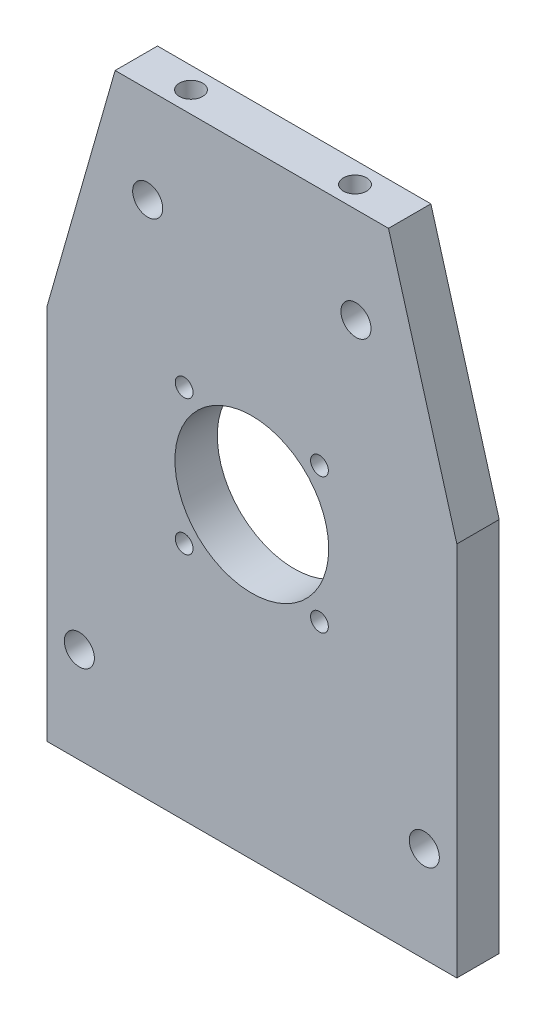
ISO-10303-21;
HEADER;
FILE_DESCRIPTION(('STEP AP214'),'2;1');
FILE_NAME('part.step','',(''),(''),'','','');
FILE_SCHEMA(('AUTOMOTIVE_DESIGN { 1 0 10303 214 1 1 1 1 }'));
ENDSEC;
DATA;
#1=APPLICATION_CONTEXT('core data for automotive mechanical design processes');
#2=APPLICATION_PROTOCOL_DEFINITION('international standard','automotive_design',2000,#1);
#3=PRODUCT_CONTEXT('',#1,'mechanical');
#4=PRODUCT('Part','Part','',(#3));
#5=PRODUCT_RELATED_PRODUCT_CATEGORY('part','',(#4));
#6=PRODUCT_DEFINITION_FORMATION('','',#4);
#7=PRODUCT_DEFINITION_CONTEXT('part definition',#1,'design');
#8=PRODUCT_DEFINITION('design','',#6,#7);
#9=PRODUCT_DEFINITION_SHAPE('','',#8);
#10=(LENGTH_UNIT() NAMED_UNIT(*) SI_UNIT(.MILLI.,.METRE.));
#11=(NAMED_UNIT(*) PLANE_ANGLE_UNIT() SI_UNIT($,.RADIAN.));
#12=(NAMED_UNIT(*) SI_UNIT($,.STERADIAN.) SOLID_ANGLE_UNIT());
#13=UNCERTAINTY_MEASURE_WITH_UNIT(LENGTH_MEASURE(1.E-05),#10,'distance_accuracy_value','');
#14=(GEOMETRIC_REPRESENTATION_CONTEXT(3) GLOBAL_UNCERTAINTY_ASSIGNED_CONTEXT((#13)) GLOBAL_UNIT_ASSIGNED_CONTEXT((#10,
#11,#12)) REPRESENTATION_CONTEXT('',''));
#15=CARTESIAN_POINT('',(0.,0.,0.));
#16=DIRECTION('',(0.,0.,1.));
#17=DIRECTION('',(1.,0.,0.));
#18=AXIS2_PLACEMENT_3D('',#15,#16,#17);
#19=CARTESIAN_POINT('',(-20.,45.,3.1));
#20=DIRECTION('',(0.961523947640823,-0.274721127897378,0.));
#21=DIRECTION('',(0.274721127897378,0.961523947640823,0.));
#22=AXIS2_PLACEMENT_3D('',#19,#20,#21);
#23=PLANE('',#22);
#24=DIRECTION('',(-0.274721127897378,-0.961523947640823,0.));
#25=VECTOR('',#24,1.);
#26=CARTESIAN_POINT('',(-20.,45.,-3.1));
#27=LINE('',#26,#25);
#28=CARTESIAN_POINT('',(-20.,45.,-3.1));
#29=VERTEX_POINT('',#28);
#30=CARTESIAN_POINT('',(-30.,9.99999999999999,-3.1));
#31=VERTEX_POINT('',#30);
#32=EDGE_CURVE('E127',#29,#31,#27,.T.);
#33=ORIENTED_EDGE('',*,*,#32,.T.);
#34=DIRECTION('',(0.,0.,-1.));
#35=VECTOR('',#34,1.);
#36=CARTESIAN_POINT('',(-30.,9.99999999999999,3.1));
#37=LINE('',#36,#35);
#38=CARTESIAN_POINT('',(-30.,9.99999999999999,3.1));
#39=VERTEX_POINT('',#38);
#40=EDGE_CURVE('E12',#39,#31,#37,.T.);
#41=ORIENTED_EDGE('',*,*,#40,.F.);
#42=DIRECTION('',(-0.274721127897378,-0.961523947640823,0.));
#43=VECTOR('',#42,1.);
#44=CARTESIAN_POINT('',(-20.,45.,3.1));
#45=LINE('',#44,#43);
#46=CARTESIAN_POINT('',(-20.,45.,3.1));
#47=VERTEX_POINT('',#46);
#48=EDGE_CURVE('E144',#47,#39,#45,.T.);
#49=ORIENTED_EDGE('',*,*,#48,.F.);
#50=DIRECTION('',(0.,0.,-1.));
#51=VECTOR('',#50,1.);
#52=CARTESIAN_POINT('',(-20.,45.,3.1));
#53=LINE('',#52,#51);
#54=EDGE_CURVE('E123',#47,#29,#53,.T.);
#55=ORIENTED_EDGE('',*,*,#54,.T.);
#56=EDGE_LOOP('',(#33,#41,#49,#55));
#57=FACE_BOUND('',#56,.T.);
#58=ADVANCED_FACE('F41',(#57),#23,.F.);
#59=CARTESIAN_POINT('',(-30.,9.99999999999999,3.1));
#60=DIRECTION('',(1.,0.,0.));
#61=DIRECTION('',(0.,1.,0.));
#62=AXIS2_PLACEMENT_3D('',#59,#60,#61);
#63=PLANE('',#62);
#64=DIRECTION('',(0.,-1.,0.));
#65=VECTOR('',#64,1.);
#66=CARTESIAN_POINT('',(-30.,9.99999999999999,-3.1));
#67=LINE('',#66,#65);
#68=CARTESIAN_POINT('',(-30.,-45.,-3.1));
#69=VERTEX_POINT('',#68);
#70=EDGE_CURVE('E131',#31,#69,#67,.T.);
#71=ORIENTED_EDGE('',*,*,#70,.T.);
#72=DIRECTION('',(0.,0.,-1.));
#73=VECTOR('',#72,1.);
#74=CARTESIAN_POINT('',(-30.,-45.,3.1));
#75=LINE('',#74,#73);
#76=CARTESIAN_POINT('',(-30.,-45.,3.1));
#77=VERTEX_POINT('',#76);
#78=EDGE_CURVE('E51',#77,#69,#75,.T.);
#79=ORIENTED_EDGE('',*,*,#78,.F.);
#80=DIRECTION('',(0.,-1.,0.));
#81=VECTOR('',#80,1.);
#82=CARTESIAN_POINT('',(-30.,9.99999999999999,3.1));
#83=LINE('',#82,#81);
#84=EDGE_CURVE('E96',#39,#77,#83,.T.);
#85=ORIENTED_EDGE('',*,*,#84,.F.);
#86=ORIENTED_EDGE('',*,*,#40,.T.);
#87=EDGE_LOOP('',(#71,#79,#85,#86));
#88=FACE_BOUND('',#87,.T.);
#89=ADVANCED_FACE('F163',(#88),#63,.F.);
#90=CARTESIAN_POINT('',(-30.,-45.,3.1));
#91=DIRECTION('',(0.,1.,0.));
#92=DIRECTION('',(-1.,0.,0.));
#93=AXIS2_PLACEMENT_3D('',#90,#91,#92);
#94=PLANE('',#93);
#95=CARTESIAN_POINT('',(20.,-45.,0.));
#96=DIRECTION('',(0.,-1.,0.));
#97=DIRECTION('',(1.,0.,0.));
#98=AXIS2_PLACEMENT_3D('',#95,#96,#97);
#99=CIRCLE('',#98,1.7);
#100=CARTESIAN_POINT('',(21.7,-45.,0.));
#101=VERTEX_POINT('',#100);
#102=EDGE_CURVE('E230',#101,#101,#99,.T.);
#103=ORIENTED_EDGE('',*,*,#102,.F.);
#104=EDGE_LOOP('',(#103));
#105=FACE_BOUND('',#104,.T.);
#106=CARTESIAN_POINT('',(-20.,-45.,0.));
#107=DIRECTION('',(0.,-1.,0.));
#108=DIRECTION('',(-1.,0.,0.));
#109=AXIS2_PLACEMENT_3D('',#106,#107,#108);
#110=CIRCLE('',#109,1.7);
#111=CARTESIAN_POINT('',(-21.7,-45.,0.));
#112=VERTEX_POINT('',#111);
#113=EDGE_CURVE('E236',#112,#112,#110,.T.);
#114=ORIENTED_EDGE('',*,*,#113,.F.);
#115=EDGE_LOOP('',(#114));
#116=FACE_BOUND('',#115,.T.);
#117=CARTESIAN_POINT('',(0.,-45.,0.));
#118=DIRECTION('',(0.,-1.,0.));
#119=DIRECTION('',(1.,0.,0.));
#120=AXIS2_PLACEMENT_3D('',#117,#118,#119);
#121=CIRCLE('',#120,1.7);
#122=CARTESIAN_POINT('',(1.7,-45.,0.));
#123=VERTEX_POINT('',#122);
#124=EDGE_CURVE('E210',#123,#123,#121,.T.);
#125=ORIENTED_EDGE('',*,*,#124,.F.);
#126=EDGE_LOOP('',(#125));
#127=FACE_BOUND('',#126,.T.);
#128=DIRECTION('',(1.,0.,0.));
#129=VECTOR('',#128,1.);
#130=CARTESIAN_POINT('',(-30.,-45.,-3.1));
#131=LINE('',#130,#129);
#132=CARTESIAN_POINT('',(30.,-45.,-3.1));
#133=VERTEX_POINT('',#132);
#134=EDGE_CURVE('E154',#69,#133,#131,.T.);
#135=ORIENTED_EDGE('',*,*,#134,.T.);
#136=DIRECTION('',(0.,0.,-1.));
#137=VECTOR('',#136,1.);
#138=CARTESIAN_POINT('',(30.,-45.,3.1));
#139=LINE('',#138,#137);
#140=CARTESIAN_POINT('',(30.,-45.,3.1));
#141=VERTEX_POINT('',#140);
#142=EDGE_CURVE('E118',#141,#133,#139,.T.);
#143=ORIENTED_EDGE('',*,*,#142,.F.);
#144=DIRECTION('',(1.,0.,0.));
#145=VECTOR('',#144,1.);
#146=CARTESIAN_POINT('',(-30.,-45.,3.1));
#147=LINE('',#146,#145);
#148=EDGE_CURVE('E109',#77,#141,#147,.T.);
#149=ORIENTED_EDGE('',*,*,#148,.F.);
#150=ORIENTED_EDGE('',*,*,#78,.T.);
#151=EDGE_LOOP('',(#135,#143,#149,#150));
#152=FACE_BOUND('',#151,.T.);
#153=ADVANCED_FACE('F153',(#105,#116,#127,#152),#94,.F.);
#154=CARTESIAN_POINT('',(30.,10.,3.1));
#155=DIRECTION('',(-1.,0.,0.));
#156=DIRECTION('',(0.,-1.,0.));
#157=AXIS2_PLACEMENT_3D('',#154,#155,#156);
#158=PLANE('',#157);
#159=DIRECTION('',(0.,1.,0.));
#160=VECTOR('',#159,1.);
#161=CARTESIAN_POINT('',(30.,10.,-3.1));
#162=LINE('',#161,#160);
#163=CARTESIAN_POINT('',(30.,10.,-3.1));
#164=VERTEX_POINT('',#163);
#165=EDGE_CURVE('E117',#133,#164,#162,.T.);
#166=ORIENTED_EDGE('',*,*,#165,.T.);
#167=DIRECTION('',(0.,0.,-1.));
#168=VECTOR('',#167,1.);
#169=CARTESIAN_POINT('',(30.,10.,3.1));
#170=LINE('',#169,#168);
#171=CARTESIAN_POINT('',(30.,10.,3.1));
#172=VERTEX_POINT('',#171);
#173=EDGE_CURVE('E114',#172,#164,#170,.T.);
#174=ORIENTED_EDGE('',*,*,#173,.F.);
#175=DIRECTION('',(0.,1.,0.));
#176=VECTOR('',#175,1.);
#177=CARTESIAN_POINT('',(30.,10.,3.1));
#178=LINE('',#177,#176);
#179=EDGE_CURVE('E103',#141,#172,#178,.T.);
#180=ORIENTED_EDGE('',*,*,#179,.F.);
#181=ORIENTED_EDGE('',*,*,#142,.T.);
#182=EDGE_LOOP('',(#166,#174,#180,#181));
#183=FACE_BOUND('',#182,.T.);
#184=ADVANCED_FACE('F115',(#183),#158,.F.);
#185=CARTESIAN_POINT('',(20.,45.,3.1));
#186=DIRECTION('',(-0.961523947640823,-0.274721127897379,0.));
#187=DIRECTION('',(0.274721127897379,-0.961523947640823,0.));
#188=AXIS2_PLACEMENT_3D('',#185,#186,#187);
#189=PLANE('',#188);
#190=DIRECTION('',(-0.274721127897379,0.961523947640823,0.));
#191=VECTOR('',#190,1.);
#192=CARTESIAN_POINT('',(20.,45.,-3.1));
#193=LINE('',#192,#191);
#194=CARTESIAN_POINT('',(20.,45.,-3.1));
#195=VERTEX_POINT('',#194);
#196=EDGE_CURVE('E82',#164,#195,#193,.T.);
#197=ORIENTED_EDGE('',*,*,#196,.T.);
#198=DIRECTION('',(0.,0.,-1.));
#199=VECTOR('',#198,1.);
#200=CARTESIAN_POINT('',(20.,45.,3.1));
#201=LINE('',#200,#199);
#202=CARTESIAN_POINT('',(20.,45.,3.1));
#203=VERTEX_POINT('',#202);
#204=EDGE_CURVE('E119',#203,#195,#201,.T.);
#205=ORIENTED_EDGE('',*,*,#204,.F.);
#206=DIRECTION('',(-0.274721127897379,0.961523947640823,0.));
#207=VECTOR('',#206,1.);
#208=CARTESIAN_POINT('',(20.,45.,3.1));
#209=LINE('',#208,#207);
#210=EDGE_CURVE('E107',#172,#203,#209,.T.);
#211=ORIENTED_EDGE('',*,*,#210,.F.);
#212=ORIENTED_EDGE('',*,*,#173,.T.);
#213=EDGE_LOOP('',(#197,#205,#211,#212));
#214=FACE_BOUND('',#213,.T.);
#215=ADVANCED_FACE('F121',(#214),#189,.F.);
#216=CARTESIAN_POINT('',(-20.,45.,3.1));
#217=DIRECTION('',(0.,-1.,0.));
#218=DIRECTION('',(1.,0.,0.));
#219=AXIS2_PLACEMENT_3D('',#216,#217,#218);
#220=PLANE('',#219);
#221=CARTESIAN_POINT('',(-12.,45.,0.));
#222=DIRECTION('',(0.,1.,0.));
#223=DIRECTION('',(-1.,0.,0.));
#224=AXIS2_PLACEMENT_3D('',#221,#222,#223);
#225=CIRCLE('',#224,1.7);
#226=CARTESIAN_POINT('',(-13.7,45.,0.));
#227=VERTEX_POINT('',#226);
#228=EDGE_CURVE('E244',#227,#227,#225,.T.);
#229=ORIENTED_EDGE('',*,*,#228,.F.);
#230=EDGE_LOOP('',(#229));
#231=FACE_BOUND('',#230,.T.);
#232=CARTESIAN_POINT('',(12.,45.,0.));
#233=DIRECTION('',(0.,1.,0.));
#234=DIRECTION('',(1.,0.,0.));
#235=AXIS2_PLACEMENT_3D('',#232,#233,#234);
#236=CIRCLE('',#235,1.7);
#237=CARTESIAN_POINT('',(13.7,45.,0.));
#238=VERTEX_POINT('',#237);
#239=EDGE_CURVE('E229',#238,#238,#236,.T.);
#240=ORIENTED_EDGE('',*,*,#239,.F.);
#241=EDGE_LOOP('',(#240));
#242=FACE_BOUND('',#241,.T.);
#243=DIRECTION('',(-1.,0.,0.));
#244=VECTOR('',#243,1.);
#245=CARTESIAN_POINT('',(-20.,45.,-3.1));
#246=LINE('',#245,#244);
#247=EDGE_CURVE('E88',#195,#29,#246,.T.);
#248=ORIENTED_EDGE('',*,*,#247,.T.);
#249=ORIENTED_EDGE('',*,*,#54,.F.);
#250=DIRECTION('',(-1.,0.,0.));
#251=VECTOR('',#250,1.);
#252=CARTESIAN_POINT('',(-20.,45.,3.1));
#253=LINE('',#252,#251);
#254=EDGE_CURVE('E59',#203,#47,#253,.T.);
#255=ORIENTED_EDGE('',*,*,#254,.F.);
#256=ORIENTED_EDGE('',*,*,#204,.T.);
#257=EDGE_LOOP('',(#248,#249,#255,#256));
#258=FACE_BOUND('',#257,.T.);
#259=ADVANCED_FACE('F269',(#231,#242,#258),#220,.F.);
#260=CARTESIAN_POINT('',(0.,0.,3.1));
#261=DIRECTION('',(0.,0.,1.));
#262=DIRECTION('',(1.,0.,0.));
#263=AXIS2_PLACEMENT_3D('',#260,#261,#262);
#264=PLANE('',#263);
#265=CARTESIAN_POINT('',(-25.2375,-31.,3.1));
#266=DIRECTION('',(0.,0.,1.));
#267=DIRECTION('',(1.,0.,0.));
#268=AXIS2_PLACEMENT_3D('',#265,#266,#267);
#269=CIRCLE('',#268,2.2);
#270=CARTESIAN_POINT('',(-23.0375,-31.,3.1));
#271=VERTEX_POINT('',#270);
#272=EDGE_CURVE('E195',#271,#271,#269,.T.);
#273=ORIENTED_EDGE('',*,*,#272,.F.);
#274=EDGE_LOOP('',(#273));
#275=FACE_BOUND('',#274,.T.);
#276=CARTESIAN_POINT('',(15.2375,31.,3.1));
#277=DIRECTION('',(0.,0.,1.));
#278=DIRECTION('',(-1.,0.,0.));
#279=AXIS2_PLACEMENT_3D('',#276,#277,#278);
#280=CIRCLE('',#279,2.2);
#281=CARTESIAN_POINT('',(13.0375,31.,3.1));
#282=VERTEX_POINT('',#281);
#283=EDGE_CURVE('E206',#282,#282,#280,.T.);
#284=ORIENTED_EDGE('',*,*,#283,.F.);
#285=EDGE_LOOP('',(#284));
#286=FACE_BOUND('',#285,.T.);
#287=CARTESIAN_POINT('',(-15.2375,31.,3.1));
#288=DIRECTION('',(0.,0.,1.));
#289=DIRECTION('',(1.,0.,0.));
#290=AXIS2_PLACEMENT_3D('',#287,#288,#289);
#291=CIRCLE('',#290,2.2);
#292=CARTESIAN_POINT('',(-13.0375,31.,3.1));
#293=VERTEX_POINT('',#292);
#294=EDGE_CURVE('E201',#293,#293,#291,.T.);
#295=ORIENTED_EDGE('',*,*,#294,.F.);
#296=EDGE_LOOP('',(#295));
#297=FACE_BOUND('',#296,.T.);
#298=CARTESIAN_POINT('',(25.2375,-31.,3.1));
#299=DIRECTION('',(0.,0.,1.));
#300=DIRECTION('',(-1.,0.,0.));
#301=AXIS2_PLACEMENT_3D('',#298,#299,#300);
#302=CIRCLE('',#301,2.2);
#303=CARTESIAN_POINT('',(23.0375,-31.,3.1));
#304=VERTEX_POINT('',#303);
#305=EDGE_CURVE('E196',#304,#304,#302,.T.);
#306=ORIENTED_EDGE('',*,*,#305,.F.);
#307=EDGE_LOOP('',(#306));
#308=FACE_BOUND('',#307,.T.);
#309=CARTESIAN_POINT('',(-9.89949493661113,-9.89949493661165,3.1));
#310=DIRECTION('',(0.,0.,1.));
#311=DIRECTION('',(1.,0.,0.));
#312=AXIS2_PLACEMENT_3D('',#309,#310,#311);
#313=CIRCLE('',#312,1.3);
#314=CARTESIAN_POINT('',(-8.59949493661112,-9.89949493661165,3.1));
#315=VERTEX_POINT('',#314);
#316=EDGE_CURVE('E190',#315,#315,#313,.T.);
#317=ORIENTED_EDGE('',*,*,#316,.F.);
#318=EDGE_LOOP('',(#317));
#319=FACE_BOUND('',#318,.T.);
#320=CARTESIAN_POINT('',(9.89949493661221,-9.89949493661113,3.1));
#321=DIRECTION('',(0.,0.,1.));
#322=DIRECTION('',(1.,0.,0.));
#323=AXIS2_PLACEMENT_3D('',#320,#321,#322);
#324=CIRCLE('',#323,1.3);
#325=CARTESIAN_POINT('',(11.1994949366122,-9.89949493661113,3.1));
#326=VERTEX_POINT('',#325);
#327=EDGE_CURVE('E185',#326,#326,#324,.T.);
#328=ORIENTED_EDGE('',*,*,#327,.F.);
#329=EDGE_LOOP('',(#328));
#330=FACE_BOUND('',#329,.T.);
#331=CARTESIAN_POINT('',(9.89949493661168,9.8994949366122,3.1));
#332=DIRECTION('',(0.,0.,1.));
#333=DIRECTION('',(1.,0.,0.));
#334=AXIS2_PLACEMENT_3D('',#331,#332,#333);
#335=CIRCLE('',#334,1.3);
#336=CARTESIAN_POINT('',(11.1994949366117,9.8994949366122,3.1));
#337=VERTEX_POINT('',#336);
#338=EDGE_CURVE('E180',#337,#337,#335,.T.);
#339=ORIENTED_EDGE('',*,*,#338,.F.);
#340=EDGE_LOOP('',(#339));
#341=FACE_BOUND('',#340,.T.);
#342=CARTESIAN_POINT('',(-9.89949493661172,9.89949493661161,3.1));
#343=DIRECTION('',(0.,0.,1.));
#344=DIRECTION('',(1.,0.,0.));
#345=AXIS2_PLACEMENT_3D('',#342,#343,#344);
#346=CIRCLE('',#345,1.3);
#347=CARTESIAN_POINT('',(-8.59949493661172,9.89949493661161,3.1));
#348=VERTEX_POINT('',#347);
#349=EDGE_CURVE('E175',#348,#348,#346,.T.);
#350=ORIENTED_EDGE('',*,*,#349,.F.);
#351=EDGE_LOOP('',(#350));
#352=FACE_BOUND('',#351,.T.);
#353=CARTESIAN_POINT('',(0.,0.,3.1));
#354=DIRECTION('',(0.,0.,1.));
#355=DIRECTION('',(1.,0.,0.));
#356=AXIS2_PLACEMENT_3D('',#353,#354,#355);
#357=CIRCLE('',#356,11.25);
#358=CARTESIAN_POINT('',(11.25,0.,3.1));
#359=VERTEX_POINT('',#358);
#360=EDGE_CURVE('E171',#359,#359,#357,.T.);
#361=ORIENTED_EDGE('',*,*,#360,.F.);
#362=EDGE_LOOP('',(#361));
#363=FACE_BOUND('',#362,.T.);
#364=ORIENTED_EDGE('',*,*,#48,.T.);
#365=ORIENTED_EDGE('',*,*,#84,.T.);
#366=ORIENTED_EDGE('',*,*,#148,.T.);
#367=ORIENTED_EDGE('',*,*,#179,.T.);
#368=ORIENTED_EDGE('',*,*,#210,.T.);
#369=ORIENTED_EDGE('',*,*,#254,.T.);
#370=EDGE_LOOP('',(#364,#365,#366,#367,#368,#369));
#371=FACE_BOUND('',#370,.T.);
#372=ADVANCED_FACE('F105',(#275,#286,#297,#308,#319,#330,#341,#352,#363,#371),#264,.T.);
#373=CARTESIAN_POINT('',(0.,0.,-3.1));
#374=DIRECTION('',(0.,0.,1.));
#375=DIRECTION('',(1.,0.,0.));
#376=AXIS2_PLACEMENT_3D('',#373,#374,#375);
#377=PLANE('',#376);
#378=CARTESIAN_POINT('',(-25.2375,-31.,-3.1));
#379=DIRECTION('',(0.,0.,1.));
#380=DIRECTION('',(1.,0.,0.));
#381=AXIS2_PLACEMENT_3D('',#378,#379,#380);
#382=CIRCLE('',#381,2.2);
#383=CARTESIAN_POINT('',(-23.0375,-31.,-3.1));
#384=VERTEX_POINT('',#383);
#385=EDGE_CURVE('E208',#384,#384,#382,.F.);
#386=ORIENTED_EDGE('',*,*,#385,.F.);
#387=EDGE_LOOP('',(#386));
#388=FACE_BOUND('',#387,.T.);
#389=CARTESIAN_POINT('',(15.2375,31.,-3.1));
#390=DIRECTION('',(0.,0.,1.));
#391=DIRECTION('',(1.,0.,0.));
#392=AXIS2_PLACEMENT_3D('',#389,#390,#391);
#393=CIRCLE('',#392,2.2);
#394=CARTESIAN_POINT('',(17.4375,31.,-3.1));
#395=VERTEX_POINT('',#394);
#396=EDGE_CURVE('E203',#395,#395,#393,.F.);
#397=ORIENTED_EDGE('',*,*,#396,.F.);
#398=EDGE_LOOP('',(#397));
#399=FACE_BOUND('',#398,.T.);
#400=CARTESIAN_POINT('',(-15.2375,31.,-3.1));
#401=DIRECTION('',(0.,0.,1.));
#402=DIRECTION('',(1.,0.,0.));
#403=AXIS2_PLACEMENT_3D('',#400,#401,#402);
#404=CIRCLE('',#403,2.2);
#405=CARTESIAN_POINT('',(-13.0375,31.,-3.1));
#406=VERTEX_POINT('',#405);
#407=EDGE_CURVE('E198',#406,#406,#404,.F.);
#408=ORIENTED_EDGE('',*,*,#407,.F.);
#409=EDGE_LOOP('',(#408));
#410=FACE_BOUND('',#409,.T.);
#411=CARTESIAN_POINT('',(25.2375,-31.,-3.1));
#412=DIRECTION('',(0.,0.,1.));
#413=DIRECTION('',(1.,0.,0.));
#414=AXIS2_PLACEMENT_3D('',#411,#412,#413);
#415=CIRCLE('',#414,2.2);
#416=CARTESIAN_POINT('',(27.4375,-31.,-3.1));
#417=VERTEX_POINT('',#416);
#418=EDGE_CURVE('E192',#417,#417,#415,.F.);
#419=ORIENTED_EDGE('',*,*,#418,.F.);
#420=EDGE_LOOP('',(#419));
#421=FACE_BOUND('',#420,.T.);
#422=CARTESIAN_POINT('',(-9.89949493661113,-9.89949493661165,-3.1));
#423=DIRECTION('',(0.,0.,1.));
#424=DIRECTION('',(1.,0.,0.));
#425=AXIS2_PLACEMENT_3D('',#422,#423,#424);
#426=CIRCLE('',#425,1.3);
#427=CARTESIAN_POINT('',(-8.59949493661112,-9.89949493661165,-3.1));
#428=VERTEX_POINT('',#427);
#429=EDGE_CURVE('E187',#428,#428,#426,.F.);
#430=ORIENTED_EDGE('',*,*,#429,.F.);
#431=EDGE_LOOP('',(#430));
#432=FACE_BOUND('',#431,.T.);
#433=CARTESIAN_POINT('',(9.89949493661221,-9.89949493661113,-3.1));
#434=DIRECTION('',(0.,0.,1.));
#435=DIRECTION('',(1.,0.,0.));
#436=AXIS2_PLACEMENT_3D('',#433,#434,#435);
#437=CIRCLE('',#436,1.3);
#438=CARTESIAN_POINT('',(11.1994949366122,-9.89949493661113,-3.1));
#439=VERTEX_POINT('',#438);
#440=EDGE_CURVE('E182',#439,#439,#437,.F.);
#441=ORIENTED_EDGE('',*,*,#440,.F.);
#442=EDGE_LOOP('',(#441));
#443=FACE_BOUND('',#442,.T.);
#444=CARTESIAN_POINT('',(9.89949493661168,9.8994949366122,-3.1));
#445=DIRECTION('',(0.,0.,1.));
#446=DIRECTION('',(1.,0.,0.));
#447=AXIS2_PLACEMENT_3D('',#444,#445,#446);
#448=CIRCLE('',#447,1.3);
#449=CARTESIAN_POINT('',(11.1994949366117,9.8994949366122,-3.1));
#450=VERTEX_POINT('',#449);
#451=EDGE_CURVE('E177',#450,#450,#448,.F.);
#452=ORIENTED_EDGE('',*,*,#451,.F.);
#453=EDGE_LOOP('',(#452));
#454=FACE_BOUND('',#453,.T.);
#455=CARTESIAN_POINT('',(-9.89949493661172,9.89949493661161,-3.1));
#456=DIRECTION('',(0.,0.,1.));
#457=DIRECTION('',(1.,0.,0.));
#458=AXIS2_PLACEMENT_3D('',#455,#456,#457);
#459=CIRCLE('',#458,1.3);
#460=CARTESIAN_POINT('',(-8.59949493661172,9.89949493661161,-3.1));
#461=VERTEX_POINT('',#460);
#462=EDGE_CURVE('E172',#461,#461,#459,.F.);
#463=ORIENTED_EDGE('',*,*,#462,.F.);
#464=EDGE_LOOP('',(#463));
#465=FACE_BOUND('',#464,.T.);
#466=CARTESIAN_POINT('',(0.,0.,-3.1));
#467=DIRECTION('',(0.,0.,1.));
#468=DIRECTION('',(1.,0.,0.));
#469=AXIS2_PLACEMENT_3D('',#466,#467,#468);
#470=CIRCLE('',#469,11.25);
#471=CARTESIAN_POINT('',(11.25,0.,-3.1));
#472=VERTEX_POINT('',#471);
#473=EDGE_CURVE('E44',#472,#472,#470,.T.);
#474=ORIENTED_EDGE('',*,*,#473,.T.);
#475=EDGE_LOOP('',(#474));
#476=FACE_BOUND('',#475,.T.);
#477=ORIENTED_EDGE('',*,*,#32,.F.);
#478=ORIENTED_EDGE('',*,*,#247,.F.);
#479=ORIENTED_EDGE('',*,*,#196,.F.);
#480=ORIENTED_EDGE('',*,*,#165,.F.);
#481=ORIENTED_EDGE('',*,*,#134,.F.);
#482=ORIENTED_EDGE('',*,*,#70,.F.);
#483=EDGE_LOOP('',(#477,#478,#479,#480,#481,#482));
#484=FACE_BOUND('',#483,.T.);
#485=ADVANCED_FACE('F157',(#388,#399,#410,#421,#432,#443,#454,#465,#476,#484),#377,.F.);
#486=CARTESIAN_POINT('',(0.,0.,-8.));
#487=DIRECTION('',(0.,0.,1.));
#488=DIRECTION('',(1.,0.,0.));
#489=AXIS2_PLACEMENT_3D('',#486,#487,#488);
#490=CYLINDRICAL_SURFACE('',#489,11.25);
#491=ORIENTED_EDGE('',*,*,#360,.T.);
#492=EDGE_LOOP('',(#491));
#493=FACE_BOUND('',#492,.T.);
#494=ORIENTED_EDGE('',*,*,#473,.F.);
#495=EDGE_LOOP('',(#494));
#496=FACE_BOUND('',#495,.T.);
#497=ADVANCED_FACE('F265',(#493,#496),#490,.F.);
#498=CARTESIAN_POINT('',(-9.89949493661172,9.89949493661161,-6.77695526217005));
#499=DIRECTION('',(0.,0.,1.));
#500=DIRECTION('',(1.,0.,0.));
#501=AXIS2_PLACEMENT_3D('',#498,#499,#500);
#502=CYLINDRICAL_SURFACE('',#501,1.3);
#503=ORIENTED_EDGE('',*,*,#462,.T.);
#504=EDGE_LOOP('',(#503));
#505=FACE_BOUND('',#504,.T.);
#506=ORIENTED_EDGE('',*,*,#349,.T.);
#507=EDGE_LOOP('',(#506));
#508=FACE_BOUND('',#507,.T.);
#509=ADVANCED_FACE('F480',(#505,#508),#502,.F.);
#510=CARTESIAN_POINT('',(9.89949493661168,9.8994949366122,-6.77695526217005));
#511=DIRECTION('',(0.,0.,1.));
#512=DIRECTION('',(1.,0.,0.));
#513=AXIS2_PLACEMENT_3D('',#510,#511,#512);
#514=CYLINDRICAL_SURFACE('',#513,1.3);
#515=ORIENTED_EDGE('',*,*,#451,.T.);
#516=EDGE_LOOP('',(#515));
#517=FACE_BOUND('',#516,.T.);
#518=ORIENTED_EDGE('',*,*,#338,.T.);
#519=EDGE_LOOP('',(#518));
#520=FACE_BOUND('',#519,.T.);
#521=ADVANCED_FACE('F476',(#517,#520),#514,.F.);
#522=CARTESIAN_POINT('',(9.89949493661221,-9.89949493661113,-6.77695526217005));
#523=DIRECTION('',(0.,0.,1.));
#524=DIRECTION('',(1.,0.,0.));
#525=AXIS2_PLACEMENT_3D('',#522,#523,#524);
#526=CYLINDRICAL_SURFACE('',#525,1.3);
#527=ORIENTED_EDGE('',*,*,#440,.T.);
#528=EDGE_LOOP('',(#527));
#529=FACE_BOUND('',#528,.T.);
#530=ORIENTED_EDGE('',*,*,#327,.T.);
#531=EDGE_LOOP('',(#530));
#532=FACE_BOUND('',#531,.T.);
#533=ADVANCED_FACE('F479',(#529,#532),#526,.F.);
#534=CARTESIAN_POINT('',(-9.89949493661113,-9.89949493661165,-6.77695526217005));
#535=DIRECTION('',(0.,0.,1.));
#536=DIRECTION('',(1.,0.,0.));
#537=AXIS2_PLACEMENT_3D('',#534,#535,#536);
#538=CYLINDRICAL_SURFACE('',#537,1.3);
#539=ORIENTED_EDGE('',*,*,#429,.T.);
#540=EDGE_LOOP('',(#539));
#541=FACE_BOUND('',#540,.T.);
#542=ORIENTED_EDGE('',*,*,#316,.T.);
#543=EDGE_LOOP('',(#542));
#544=FACE_BOUND('',#543,.T.);
#545=ADVANCED_FACE('F312',(#541,#544),#538,.F.);
#546=CARTESIAN_POINT('',(12.,37.,0.));
#547=DIRECTION('',(0.,1.,0.));
#548=DIRECTION('',(-1.,0.,0.));
#549=AXIS2_PLACEMENT_3D('',#546,#547,#548);
#550=CYLINDRICAL_SURFACE('',#549,1.7);
#551=CARTESIAN_POINT('',(12.,37.,0.));
#552=DIRECTION('',(0.,1.,0.));
#553=DIRECTION('',(1.,0.,0.));
#554=AXIS2_PLACEMENT_3D('',#551,#552,#553);
#555=CIRCLE('',#554,1.7);
#556=CARTESIAN_POINT('',(13.7,37.,0.));
#557=VERTEX_POINT('',#556);
#558=EDGE_CURVE('E247',#557,#557,#555,.T.);
#559=ORIENTED_EDGE('',*,*,#558,.F.);
#560=EDGE_LOOP('',(#559));
#561=FACE_BOUND('',#560,.T.);
#562=ORIENTED_EDGE('',*,*,#239,.T.);
#563=EDGE_LOOP('',(#562));
#564=FACE_BOUND('',#563,.T.);
#565=ADVANCED_FACE('F317',(#561,#564),#550,.F.);
#566=CARTESIAN_POINT('',(12.,37.,0.));
#567=DIRECTION('',(0.,-1.,0.));
#568=DIRECTION('',(1.,0.,0.));
#569=AXIS2_PLACEMENT_3D('',#566,#567,#568);
#570=PLANE('',#569);
#571=ORIENTED_EDGE('',*,*,#558,.T.);
#572=EDGE_LOOP('',(#571));
#573=FACE_BOUND('',#572,.T.);
#574=ADVANCED_FACE('F322',(#573),#570,.F.);
#575=CARTESIAN_POINT('',(-12.,37.,0.));
#576=DIRECTION('',(0.,1.,0.));
#577=DIRECTION('',(-1.,0.,0.));
#578=AXIS2_PLACEMENT_3D('',#575,#576,#577);
#579=CYLINDRICAL_SURFACE('',#578,1.7);
#580=CARTESIAN_POINT('',(-12.,37.,0.));
#581=DIRECTION('',(0.,1.,0.));
#582=DIRECTION('',(-1.,0.,0.));
#583=AXIS2_PLACEMENT_3D('',#580,#581,#582);
#584=CIRCLE('',#583,1.7);
#585=CARTESIAN_POINT('',(-13.7,37.,0.));
#586=VERTEX_POINT('',#585);
#587=EDGE_CURVE('E241',#586,#586,#584,.T.);
#588=ORIENTED_EDGE('',*,*,#587,.F.);
#589=EDGE_LOOP('',(#588));
#590=FACE_BOUND('',#589,.T.);
#591=ORIENTED_EDGE('',*,*,#228,.T.);
#592=EDGE_LOOP('',(#591));
#593=FACE_BOUND('',#592,.T.);
#594=ADVANCED_FACE('F332',(#590,#593),#579,.F.);
#595=CARTESIAN_POINT('',(-12.,37.,0.));
#596=DIRECTION('',(0.,1.,0.));
#597=DIRECTION('',(-1.,0.,0.));
#598=AXIS2_PLACEMENT_3D('',#595,#596,#597);
#599=PLANE('',#598);
#600=ORIENTED_EDGE('',*,*,#587,.T.);
#601=EDGE_LOOP('',(#600));
#602=FACE_BOUND('',#601,.T.);
#603=ADVANCED_FACE('F342',(#602),#599,.T.);
#604=CARTESIAN_POINT('',(0.,-37.,0.));
#605=DIRECTION('',(0.,-1.,0.));
#606=DIRECTION('',(1.,0.,0.));
#607=AXIS2_PLACEMENT_3D('',#604,#605,#606);
#608=CYLINDRICAL_SURFACE('',#607,1.7);
#609=CARTESIAN_POINT('',(0.,-37.,0.));
#610=DIRECTION('',(0.,-1.,0.));
#611=DIRECTION('',(1.,0.,0.));
#612=AXIS2_PLACEMENT_3D('',#609,#610,#611);
#613=CIRCLE('',#612,1.7);
#614=CARTESIAN_POINT('',(1.7,-37.,0.));
#615=VERTEX_POINT('',#614);
#616=EDGE_CURVE('E215',#615,#615,#613,.T.);
#617=ORIENTED_EDGE('',*,*,#616,.F.);
#618=EDGE_LOOP('',(#617));
#619=FACE_BOUND('',#618,.T.);
#620=ORIENTED_EDGE('',*,*,#124,.T.);
#621=EDGE_LOOP('',(#620));
#622=FACE_BOUND('',#621,.T.);
#623=ADVANCED_FACE('F352',(#619,#622),#608,.F.);
#624=CARTESIAN_POINT('',(0.,-37.,0.));
#625=DIRECTION('',(0.,-1.,0.));
#626=DIRECTION('',(1.,0.,0.));
#627=AXIS2_PLACEMENT_3D('',#624,#625,#626);
#628=PLANE('',#627);
#629=ORIENTED_EDGE('',*,*,#616,.T.);
#630=EDGE_LOOP('',(#629));
#631=FACE_BOUND('',#630,.T.);
#632=ADVANCED_FACE('F370',(#631),#628,.T.);
#633=CARTESIAN_POINT('',(-20.,-37.,0.));
#634=DIRECTION('',(0.,-1.,0.));
#635=DIRECTION('',(1.,0.,0.));
#636=AXIS2_PLACEMENT_3D('',#633,#634,#635);
#637=CYLINDRICAL_SURFACE('',#636,1.7);
#638=CARTESIAN_POINT('',(-20.,-37.,0.));
#639=DIRECTION('',(0.,-1.,0.));
#640=DIRECTION('',(-1.,0.,0.));
#641=AXIS2_PLACEMENT_3D('',#638,#639,#640);
#642=CIRCLE('',#641,1.7);
#643=CARTESIAN_POINT('',(-21.7,-37.,0.));
#644=VERTEX_POINT('',#643);
#645=EDGE_CURVE('E233',#644,#644,#642,.T.);
#646=ORIENTED_EDGE('',*,*,#645,.F.);
#647=EDGE_LOOP('',(#646));
#648=FACE_BOUND('',#647,.T.);
#649=ORIENTED_EDGE('',*,*,#113,.T.);
#650=EDGE_LOOP('',(#649));
#651=FACE_BOUND('',#650,.T.);
#652=ADVANCED_FACE('F380',(#648,#651),#637,.F.);
#653=CARTESIAN_POINT('',(-20.,-37.,0.));
#654=DIRECTION('',(0.,1.,0.));
#655=DIRECTION('',(-1.,0.,0.));
#656=AXIS2_PLACEMENT_3D('',#653,#654,#655);
#657=PLANE('',#656);
#658=ORIENTED_EDGE('',*,*,#645,.T.);
#659=EDGE_LOOP('',(#658));
#660=FACE_BOUND('',#659,.T.);
#661=ADVANCED_FACE('F390',(#660),#657,.F.);
#662=CARTESIAN_POINT('',(20.,-37.,0.));
#663=DIRECTION('',(0.,-1.,0.));
#664=DIRECTION('',(1.,0.,0.));
#665=AXIS2_PLACEMENT_3D('',#662,#663,#664);
#666=CYLINDRICAL_SURFACE('',#665,1.7);
#667=CARTESIAN_POINT('',(20.,-37.,0.));
#668=DIRECTION('',(0.,-1.,0.));
#669=DIRECTION('',(1.,0.,0.));
#670=AXIS2_PLACEMENT_3D('',#667,#668,#669);
#671=CIRCLE('',#670,1.7);
#672=CARTESIAN_POINT('',(21.7,-37.,0.));
#673=VERTEX_POINT('',#672);
#674=EDGE_CURVE('E226',#673,#673,#671,.T.);
#675=ORIENTED_EDGE('',*,*,#674,.F.);
#676=EDGE_LOOP('',(#675));
#677=FACE_BOUND('',#676,.T.);
#678=ORIENTED_EDGE('',*,*,#102,.T.);
#679=EDGE_LOOP('',(#678));
#680=FACE_BOUND('',#679,.T.);
#681=ADVANCED_FACE('F400',(#677,#680),#666,.F.);
#682=CARTESIAN_POINT('',(20.,-37.,0.));
#683=DIRECTION('',(0.,-1.,0.));
#684=DIRECTION('',(1.,0.,0.));
#685=AXIS2_PLACEMENT_3D('',#682,#683,#684);
#686=PLANE('',#685);
#687=ORIENTED_EDGE('',*,*,#674,.T.);
#688=EDGE_LOOP('',(#687));
#689=FACE_BOUND('',#688,.T.);
#690=ADVANCED_FACE('F410',(#689),#686,.T.);
#691=CARTESIAN_POINT('',(25.2375,-31.,-9.32253967444162));
#692=DIRECTION('',(0.,0.,1.));
#693=DIRECTION('',(1.,0.,0.));
#694=AXIS2_PLACEMENT_3D('',#691,#692,#693);
#695=CYLINDRICAL_SURFACE('',#694,2.2);
#696=ORIENTED_EDGE('',*,*,#418,.T.);
#697=EDGE_LOOP('',(#696));
#698=FACE_BOUND('',#697,.T.);
#699=ORIENTED_EDGE('',*,*,#305,.T.);
#700=EDGE_LOOP('',(#699));
#701=FACE_BOUND('',#700,.T.);
#702=ADVANCED_FACE('F419',(#698,#701),#695,.F.);
#703=CARTESIAN_POINT('',(-15.2375,31.,-9.32253967444162));
#704=DIRECTION('',(0.,0.,1.));
#705=DIRECTION('',(1.,0.,0.));
#706=AXIS2_PLACEMENT_3D('',#703,#704,#705);
#707=CYLINDRICAL_SURFACE('',#706,2.2);
#708=ORIENTED_EDGE('',*,*,#407,.T.);
#709=EDGE_LOOP('',(#708));
#710=FACE_BOUND('',#709,.T.);
#711=ORIENTED_EDGE('',*,*,#294,.T.);
#712=EDGE_LOOP('',(#711));
#713=FACE_BOUND('',#712,.T.);
#714=ADVANCED_FACE('F441',(#710,#713),#707,.F.);
#715=CARTESIAN_POINT('',(15.2375,31.,-9.32253967444162));
#716=DIRECTION('',(0.,0.,1.));
#717=DIRECTION('',(1.,0.,0.));
#718=AXIS2_PLACEMENT_3D('',#715,#716,#717);
#719=CYLINDRICAL_SURFACE('',#718,2.2);
#720=ORIENTED_EDGE('',*,*,#396,.T.);
#721=EDGE_LOOP('',(#720));
#722=FACE_BOUND('',#721,.T.);
#723=ORIENTED_EDGE('',*,*,#283,.T.);
#724=EDGE_LOOP('',(#723));
#725=FACE_BOUND('',#724,.T.);
#726=ADVANCED_FACE('F451',(#722,#725),#719,.F.);
#727=CARTESIAN_POINT('',(-25.2375,-31.,-9.32253967444162));
#728=DIRECTION('',(0.,0.,1.));
#729=DIRECTION('',(1.,0.,0.));
#730=AXIS2_PLACEMENT_3D('',#727,#728,#729);
#731=CYLINDRICAL_SURFACE('',#730,2.2);
#732=ORIENTED_EDGE('',*,*,#385,.T.);
#733=EDGE_LOOP('',(#732));
#734=FACE_BOUND('',#733,.T.);
#735=ORIENTED_EDGE('',*,*,#272,.T.);
#736=EDGE_LOOP('',(#735));
#737=FACE_BOUND('',#736,.T.);
#738=ADVANCED_FACE('F461',(#734,#737),#731,.F.);
#739=CLOSED_SHELL('',(#58,#89,#153,#184,#215,#259,#372,#485,#497,#509,#521,#533,#545,#565,#574,
#594,#603,#623,#632,#652,#661,#681,#690,#702,#714,#726,#738));
#740=MANIFOLD_SOLID_BREP('B2',#739);
#741=ADVANCED_BREP_SHAPE_REPRESENTATION('',(#18,#740),#14);
#742=SHAPE_DEFINITION_REPRESENTATION(#9,#741);
ENDSEC;
END-ISO-10303-21;
